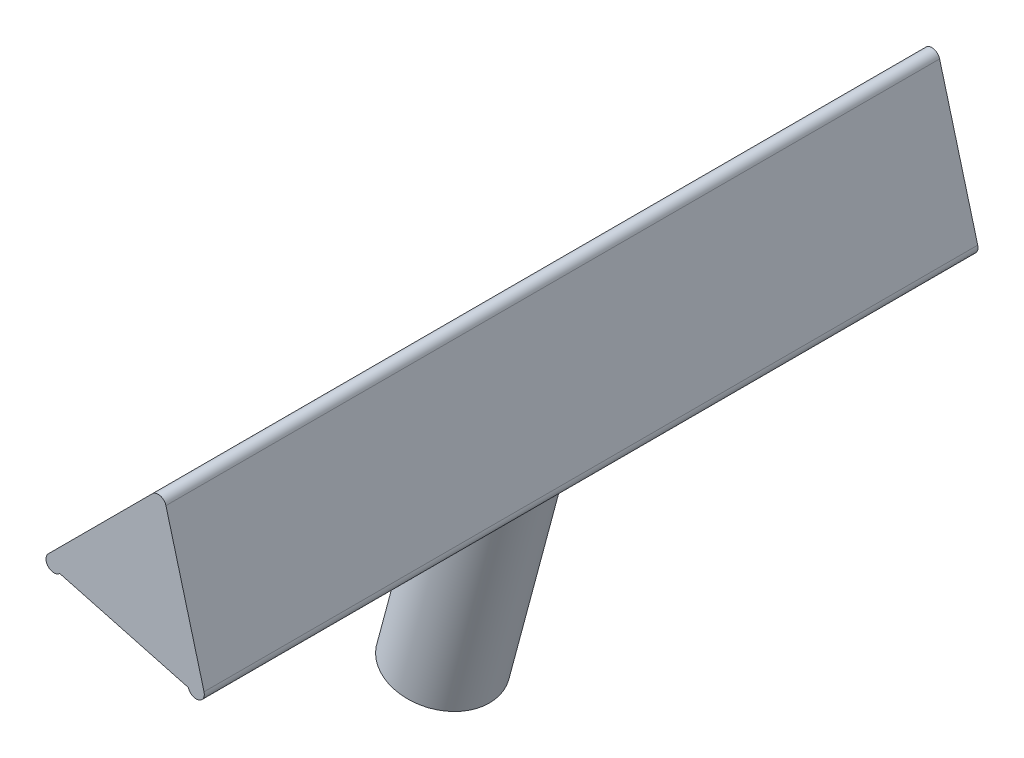
ISO-10303-21;
HEADER;
FILE_DESCRIPTION(('STEP AP214'),'2;1');
FILE_NAME('part.step','',(''),(''),'','','');
FILE_SCHEMA(('AUTOMOTIVE_DESIGN { 1 0 10303 214 1 1 1 1 }'));
ENDSEC;
DATA;
#1=APPLICATION_CONTEXT('core data for automotive mechanical design processes');
#2=APPLICATION_PROTOCOL_DEFINITION('international standard','automotive_design',2000,#1);
#3=PRODUCT_CONTEXT('',#1,'mechanical');
#4=PRODUCT('Part','Part','',(#3));
#5=PRODUCT_RELATED_PRODUCT_CATEGORY('part','',(#4));
#6=PRODUCT_DEFINITION_FORMATION('','',#4);
#7=PRODUCT_DEFINITION_CONTEXT('part definition',#1,'design');
#8=PRODUCT_DEFINITION('design','',#6,#7);
#9=PRODUCT_DEFINITION_SHAPE('','',#8);
#10=(LENGTH_UNIT() NAMED_UNIT(*) SI_UNIT(.MILLI.,.METRE.));
#11=(NAMED_UNIT(*) PLANE_ANGLE_UNIT() SI_UNIT($,.RADIAN.));
#12=(NAMED_UNIT(*) SI_UNIT($,.STERADIAN.) SOLID_ANGLE_UNIT());
#13=UNCERTAINTY_MEASURE_WITH_UNIT(LENGTH_MEASURE(1.E-05),#10,'distance_accuracy_value','');
#14=(GEOMETRIC_REPRESENTATION_CONTEXT(3) GLOBAL_UNCERTAINTY_ASSIGNED_CONTEXT((#13)) GLOBAL_UNIT_ASSIGNED_CONTEXT((#10,
#11,#12)) REPRESENTATION_CONTEXT('',''));
#15=CARTESIAN_POINT('',(0.,0.,0.));
#16=DIRECTION('',(0.,0.,1.));
#17=DIRECTION('',(1.,0.,0.));
#18=AXIS2_PLACEMENT_3D('',#15,#16,#17);
#19=CARTESIAN_POINT('',(0.353553390593274,-0.353553390593274,24.));
#20=DIRECTION('',(0.,0.,-1.));
#21=DIRECTION('',(-1.,0.,0.));
#22=AXIS2_PLACEMENT_3D('',#19,#20,#21);
#23=CYLINDRICAL_SURFACE('',#22,0.5);
#24=CARTESIAN_POINT('',(0.353553390593274,-0.353553390593274,-24.));
#25=DIRECTION('',(0.,0.,1.));
#26=DIRECTION('',(1.,0.,0.));
#27=AXIS2_PLACEMENT_3D('',#24,#25,#26);
#28=CIRCLE('',#27,0.5);
#29=CARTESIAN_POINT('',(0.,0.,-24.));
#30=VERTEX_POINT('',#29);
#31=CARTESIAN_POINT('',(0.707106781186547,-0.707106781186547,-24.));
#32=VERTEX_POINT('',#31);
#33=EDGE_CURVE('E121',#30,#32,#28,.T.);
#34=ORIENTED_EDGE('',*,*,#33,.T.);
#35=DIRECTION('',(0.,0.,-1.));
#36=VECTOR('',#35,1.);
#37=CARTESIAN_POINT('',(0.707106781186547,-0.707106781186547,24.));
#38=LINE('',#37,#36);
#39=CARTESIAN_POINT('',(0.707106781186547,-0.707106781186547,24.));
#40=VERTEX_POINT('',#39);
#41=EDGE_CURVE('E11',#40,#32,#38,.T.);
#42=ORIENTED_EDGE('',*,*,#41,.F.);
#43=CARTESIAN_POINT('',(0.353553390593274,-0.353553390593274,24.));
#44=DIRECTION('',(0.,0.,1.));
#45=DIRECTION('',(1.,0.,0.));
#46=AXIS2_PLACEMENT_3D('',#43,#44,#45);
#47=CIRCLE('',#46,0.5);
#48=CARTESIAN_POINT('',(0.,0.,24.));
#49=VERTEX_POINT('',#48);
#50=EDGE_CURVE('E88',#49,#40,#47,.T.);
#51=ORIENTED_EDGE('',*,*,#50,.F.);
#52=DIRECTION('',(0.,0.,-1.));
#53=VECTOR('',#52,1.);
#54=CARTESIAN_POINT('',(0.,0.,24.));
#55=LINE('',#54,#53);
#56=EDGE_CURVE('E117',#49,#30,#55,.T.);
#57=ORIENTED_EDGE('',*,*,#56,.T.);
#58=EDGE_LOOP('',(#34,#42,#51,#57));
#59=FACE_BOUND('',#58,.T.);
#60=ADVANCED_FACE('F39',(#59),#23,.T.);
#61=CARTESIAN_POINT('',(9.17629534974611,-2.71759997357646,24.));
#62=DIRECTION('',(0.,0.,-1.));
#63=DIRECTION('',(-1.,0.,0.));
#64=AXIS2_PLACEMENT_3D('',#61,#62,#63);
#65=CYLINDRICAL_SURFACE('',#64,0.500000000000002);
#66=CARTESIAN_POINT('',(9.17629534974611,-2.71759997357646,-24.));
#67=DIRECTION('',(0.,0.,1.));
#68=DIRECTION('',(-1.,0.,0.));
#69=AXIS2_PLACEMENT_3D('',#66,#67,#68);
#70=CIRCLE('',#69,0.500000000000002);
#71=CARTESIAN_POINT('',(8.69333243660157,-2.84700949612772,-24.));
#72=VERTEX_POINT('',#71);
#73=CARTESIAN_POINT('',(9.65925826289065,-2.5881904510252,-24.));
#74=VERTEX_POINT('',#73);
#75=EDGE_CURVE('E123',#72,#74,#70,.T.);
#76=ORIENTED_EDGE('',*,*,#75,.T.);
#77=DIRECTION('',(0.,0.,-1.));
#78=VECTOR('',#77,1.);
#79=CARTESIAN_POINT('',(9.65925826289065,-2.5881904510252,24.));
#80=LINE('',#79,#78);
#81=CARTESIAN_POINT('',(9.65925826289065,-2.5881904510252,24.));
#82=VERTEX_POINT('',#81);
#83=EDGE_CURVE('E112',#82,#74,#80,.T.);
#84=ORIENTED_EDGE('',*,*,#83,.F.);
#85=CARTESIAN_POINT('',(9.17629534974611,-2.71759997357646,24.));
#86=DIRECTION('',(0.,0.,1.));
#87=DIRECTION('',(-1.,0.,0.));
#88=AXIS2_PLACEMENT_3D('',#85,#86,#87);
#89=CIRCLE('',#88,0.500000000000002);
#90=CARTESIAN_POINT('',(8.69333243660157,-2.84700949612772,24.));
#91=VERTEX_POINT('',#90);
#92=EDGE_CURVE('E103',#91,#82,#89,.T.);
#93=ORIENTED_EDGE('',*,*,#92,.F.);
#94=DIRECTION('',(0.,0.,-1.));
#95=VECTOR('',#94,1.);
#96=CARTESIAN_POINT('',(8.69333243660157,-2.84700949612772,24.));
#97=LINE('',#96,#95);
#98=EDGE_CURVE('E47',#91,#72,#97,.T.);
#99=ORIENTED_EDGE('',*,*,#98,.T.);
#100=EDGE_LOOP('',(#76,#84,#93,#99));
#101=FACE_BOUND('',#100,.T.);
#102=ADVANCED_FACE('F135',(#101),#65,.T.);
#103=CARTESIAN_POINT('',(7.29521167990747,6.23455150812767,24.));
#104=DIRECTION('',(-0.965925826289069,-0.258819045102519,0.));
#105=DIRECTION('',(0.258819045102519,-0.965925826289069,0.));
#106=AXIS2_PLACEMENT_3D('',#103,#104,#105);
#107=PLANE('',#106);
#108=DIRECTION('',(-0.258819045102519,0.965925826289069,0.));
#109=VECTOR('',#108,1.);
#110=CARTESIAN_POINT('',(7.29521167990747,6.23455150812767,-24.));
#111=LINE('',#110,#109);
#112=CARTESIAN_POINT('',(7.29521167990747,6.23455150812767,-24.));
#113=VERTEX_POINT('',#112);
#114=EDGE_CURVE('E111',#74,#113,#111,.T.);
#115=ORIENTED_EDGE('',*,*,#114,.T.);
#116=DIRECTION('',(0.,0.,-1.));
#117=VECTOR('',#116,1.);
#118=CARTESIAN_POINT('',(7.29521167990747,6.23455150812767,24.));
#119=LINE('',#118,#117);
#120=CARTESIAN_POINT('',(7.29521167990747,6.23455150812767,24.));
#121=VERTEX_POINT('',#120);
#122=EDGE_CURVE('E108',#121,#113,#119,.T.);
#123=ORIENTED_EDGE('',*,*,#122,.F.);
#124=DIRECTION('',(-0.258819045102519,0.965925826289069,0.));
#125=VECTOR('',#124,1.);
#126=CARTESIAN_POINT('',(7.29521167990747,6.23455150812767,24.));
#127=LINE('',#126,#125);
#128=EDGE_CURVE('E98',#82,#121,#127,.T.);
#129=ORIENTED_EDGE('',*,*,#128,.F.);
#130=ORIENTED_EDGE('',*,*,#83,.T.);
#131=EDGE_LOOP('',(#115,#123,#129,#130));
#132=FACE_BOUND('',#131,.T.);
#133=ADVANCED_FACE('F109',(#132),#107,.F.);
#134=CARTESIAN_POINT('',(6.81224876676294,6.10514198557642,24.));
#135=DIRECTION('',(0.,0.,-1.));
#136=DIRECTION('',(-1.,0.,0.));
#137=AXIS2_PLACEMENT_3D('',#134,#135,#136);
#138=CYLINDRICAL_SURFACE('',#137,0.499999999999998);
#139=CARTESIAN_POINT('',(6.81224876676294,6.10514198557642,-24.));
#140=DIRECTION('',(0.,0.,1.));
#141=DIRECTION('',(-1.,0.,0.));
#142=AXIS2_PLACEMENT_3D('',#139,#140,#141);
#143=CIRCLE('',#142,0.499999999999998);
#144=CARTESIAN_POINT('',(6.45869537616966,6.45869537616969,-24.));
#145=VERTEX_POINT('',#144);
#146=EDGE_CURVE('E76',#113,#145,#143,.T.);
#147=ORIENTED_EDGE('',*,*,#146,.T.);
#148=DIRECTION('',(0.,0.,-1.));
#149=VECTOR('',#148,1.);
#150=CARTESIAN_POINT('',(6.45869537616966,6.45869537616969,24.));
#151=LINE('',#150,#149);
#152=CARTESIAN_POINT('',(6.45869537616966,6.45869537616969,24.));
#153=VERTEX_POINT('',#152);
#154=EDGE_CURVE('E113',#153,#145,#151,.T.);
#155=ORIENTED_EDGE('',*,*,#154,.F.);
#156=CARTESIAN_POINT('',(6.81224876676294,6.10514198557642,24.));
#157=DIRECTION('',(0.,0.,1.));
#158=DIRECTION('',(-1.,0.,0.));
#159=AXIS2_PLACEMENT_3D('',#156,#157,#158);
#160=CIRCLE('',#159,0.499999999999998);
#161=EDGE_CURVE('E102',#121,#153,#160,.T.);
#162=ORIENTED_EDGE('',*,*,#161,.F.);
#163=ORIENTED_EDGE('',*,*,#122,.T.);
#164=EDGE_LOOP('',(#147,#155,#162,#163));
#165=FACE_BOUND('',#164,.T.);
#166=ADVANCED_FACE('F115',(#165),#138,.T.);
#167=CARTESIAN_POINT('',(0.,0.,24.));
#168=DIRECTION('',(0.707106781186549,-0.707106781186546,0.));
#169=DIRECTION('',(0.707106781186546,0.707106781186549,0.));
#170=AXIS2_PLACEMENT_3D('',#167,#168,#169);
#171=PLANE('',#170);
#172=DIRECTION('',(-0.707106781186546,-0.707106781186549,0.));
#173=VECTOR('',#172,1.);
#174=CARTESIAN_POINT('',(0.,0.,-24.));
#175=LINE('',#174,#173);
#176=EDGE_CURVE('E82',#145,#30,#175,.T.);
#177=ORIENTED_EDGE('',*,*,#176,.T.);
#178=ORIENTED_EDGE('',*,*,#56,.F.);
#179=DIRECTION('',(-0.707106781186546,-0.707106781186549,0.));
#180=VECTOR('',#179,1.);
#181=CARTESIAN_POINT('',(0.,0.,24.));
#182=LINE('',#181,#180);
#183=EDGE_CURVE('E55',#153,#49,#182,.T.);
#184=ORIENTED_EDGE('',*,*,#183,.F.);
#185=ORIENTED_EDGE('',*,*,#154,.T.);
#186=EDGE_LOOP('',(#177,#178,#184,#185));
#187=FACE_BOUND('',#186,.T.);
#188=ADVANCED_FACE('F177',(#187),#171,.F.);
#189=CARTESIAN_POINT('',(0.353553390593274,-0.353553390593274,24.));
#190=DIRECTION('',(0.,0.,1.));
#191=DIRECTION('',(1.,0.,0.));
#192=AXIS2_PLACEMENT_3D('',#189,#190,#191);
#193=PLANE('',#192);
#194=ORIENTED_EDGE('',*,*,#50,.T.);
#195=DIRECTION('',(0.965925826289068,-0.258819045102521,0.));
#196=VECTOR('',#195,1.);
#197=CARTESIAN_POINT('',(8.69333243660157,-2.84700949612772,24.));
#198=LINE('',#197,#196);
#199=EDGE_CURVE('E143',#40,#91,#198,.T.);
#200=ORIENTED_EDGE('',*,*,#199,.T.);
#201=ORIENTED_EDGE('',*,*,#92,.T.);
#202=ORIENTED_EDGE('',*,*,#128,.T.);
#203=ORIENTED_EDGE('',*,*,#161,.T.);
#204=ORIENTED_EDGE('',*,*,#183,.T.);
#205=EDGE_LOOP('',(#194,#200,#201,#202,#203,#204));
#206=FACE_BOUND('',#205,.T.);
#207=ADVANCED_FACE('F100',(#206),#193,.T.);
#208=CARTESIAN_POINT('',(0.353553390593274,-0.353553390593274,-24.));
#209=DIRECTION('',(0.,0.,1.));
#210=DIRECTION('',(1.,0.,0.));
#211=AXIS2_PLACEMENT_3D('',#208,#209,#210);
#212=PLANE('',#211);
#213=ORIENTED_EDGE('',*,*,#33,.F.);
#214=ORIENTED_EDGE('',*,*,#176,.F.);
#215=ORIENTED_EDGE('',*,*,#146,.F.);
#216=ORIENTED_EDGE('',*,*,#114,.F.);
#217=ORIENTED_EDGE('',*,*,#75,.F.);
#218=DIRECTION('',(0.965925826289068,-0.258819045102521,0.));
#219=VECTOR('',#218,1.);
#220=CARTESIAN_POINT('',(8.69333243660157,-2.84700949612772,-24.));
#221=LINE('',#220,#219);
#222=EDGE_CURVE('E124',#32,#72,#221,.T.);
#223=ORIENTED_EDGE('',*,*,#222,.F.);
#224=EDGE_LOOP('',(#213,#214,#215,#216,#217,#223));
#225=FACE_BOUND('',#224,.T.);
#226=ADVANCED_FACE('F164',(#225),#212,.F.);
#227=CARTESIAN_POINT('',(8.69333243660157,-2.84700949612772,-24.));
#228=DIRECTION('',(-0.258819045102521,-0.965925826289068,0.));
#229=DIRECTION('',(0.965925826289068,-0.258819045102521,0.));
#230=AXIS2_PLACEMENT_3D('',#227,#228,#229);
#231=PLANE('',#230);
#232=CARTESIAN_POINT('',(4.70021960889406,-1.77705813865713,0.));
#233=DIRECTION('',(-0.258819045102521,-0.965925826289068,0.));
#234=DIRECTION('',(0.965925826289068,-0.258819045102521,0.));
#235=AXIS2_PLACEMENT_3D('',#232,#233,#234);
#236=CIRCLE('',#235,3.);
#237=CARTESIAN_POINT('',(7.59799708776127,-2.5535152739647,0.));
#238=VERTEX_POINT('',#237);
#239=EDGE_CURVE('E148',#238,#238,#236,.T.);
#240=ORIENTED_EDGE('',*,*,#239,.F.);
#241=EDGE_LOOP('',(#240));
#242=FACE_BOUND('',#241,.T.);
#243=ORIENTED_EDGE('',*,*,#199,.F.);
#244=ORIENTED_EDGE('',*,*,#41,.T.);
#245=ORIENTED_EDGE('',*,*,#222,.T.);
#246=ORIENTED_EDGE('',*,*,#98,.F.);
#247=EDGE_LOOP('',(#243,#244,#245,#246));
#248=FACE_BOUND('',#247,.T.);
#249=ADVANCED_FACE('F140',(#242,#248),#231,.T.);
#250=CARTESIAN_POINT('',(0.471116411918868,-17.5602861402205,0.));
#251=DIRECTION('',(0.258819045102521,0.965925826289068,0.));
#252=DIRECTION('',(-0.965925826289068,0.258819045102521,0.));
#253=AXIS2_PLACEMENT_3D('',#250,#251,#252);
#254=CYLINDRICAL_SURFACE('',#253,3.);
#255=CARTESIAN_POINT('',(0.471116411918868,-17.5602861402205,0.));
#256=DIRECTION('',(-0.258819045102521,-0.965925826289068,0.));
#257=DIRECTION('',(0.965925826289068,-0.258819045102521,0.));
#258=AXIS2_PLACEMENT_3D('',#255,#256,#257);
#259=CIRCLE('',#258,3.);
#260=CARTESIAN_POINT('',(3.36889389078607,-18.3367432755281,0.));
#261=VERTEX_POINT('',#260);
#262=EDGE_CURVE('E145',#261,#261,#259,.T.);
#263=ORIENTED_EDGE('',*,*,#262,.F.);
#264=EDGE_LOOP('',(#263));
#265=FACE_BOUND('',#264,.T.);
#266=ORIENTED_EDGE('',*,*,#239,.T.);
#267=EDGE_LOOP('',(#266));
#268=FACE_BOUND('',#267,.T.);
#269=ADVANCED_FACE('F157',(#265,#268),#254,.T.);
#270=CARTESIAN_POINT('',(0.471116411918868,-17.5602861402205,0.));
#271=DIRECTION('',(-0.258819045102521,-0.965925826289068,0.));
#272=DIRECTION('',(0.965925826289068,-0.258819045102521,0.));
#273=AXIS2_PLACEMENT_3D('',#270,#271,#272);
#274=PLANE('',#273);
#275=ORIENTED_EDGE('',*,*,#262,.T.);
#276=EDGE_LOOP('',(#275));
#277=FACE_BOUND('',#276,.T.);
#278=ADVANCED_FACE('F155',(#277),#274,.T.);
#279=CLOSED_SHELL('',(#60,#102,#133,#166,#188,#207,#226,#249,#269,#278));
#280=MANIFOLD_SOLID_BREP('B2',#279);
#281=ADVANCED_BREP_SHAPE_REPRESENTATION('',(#18,#280),#14);
#282=SHAPE_DEFINITION_REPRESENTATION(#9,#281);
ENDSEC;
END-ISO-10303-21;
